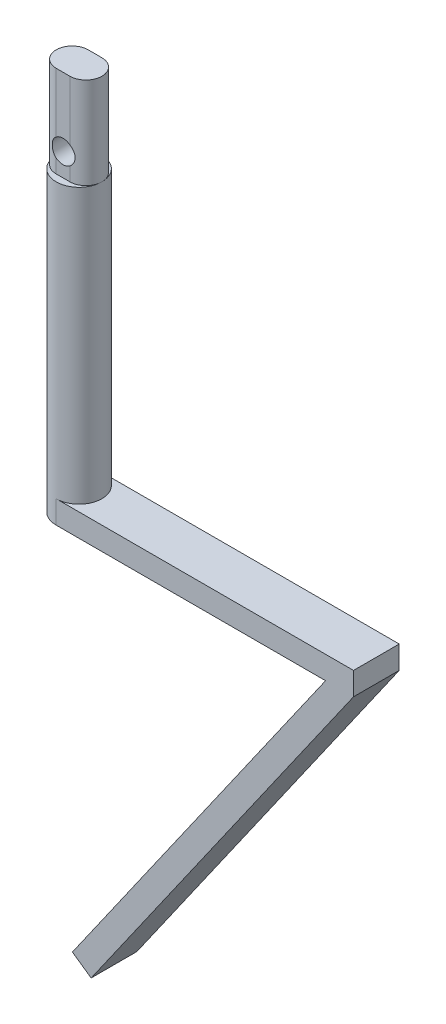
ISO-10303-21;
HEADER;
FILE_DESCRIPTION(('STEP AP214'),'2;1');
FILE_NAME('part.step','',(''),(''),'','','');
FILE_SCHEMA(('AUTOMOTIVE_DESIGN { 1 0 10303 214 1 1 1 1 }'));
ENDSEC;
DATA;
#1=APPLICATION_CONTEXT('core data for automotive mechanical design processes');
#2=APPLICATION_PROTOCOL_DEFINITION('international standard','automotive_design',2000,#1);
#3=PRODUCT_CONTEXT('',#1,'mechanical');
#4=PRODUCT('Part','Part','',(#3));
#5=PRODUCT_RELATED_PRODUCT_CATEGORY('part','',(#4));
#6=PRODUCT_DEFINITION_FORMATION('','',#4);
#7=PRODUCT_DEFINITION_CONTEXT('part definition',#1,'design');
#8=PRODUCT_DEFINITION('design','',#6,#7);
#9=PRODUCT_DEFINITION_SHAPE('','',#8);
#10=(LENGTH_UNIT() NAMED_UNIT(*) SI_UNIT(.MILLI.,.METRE.));
#11=(NAMED_UNIT(*) PLANE_ANGLE_UNIT() SI_UNIT($,.RADIAN.));
#12=(NAMED_UNIT(*) SI_UNIT($,.STERADIAN.) SOLID_ANGLE_UNIT());
#13=UNCERTAINTY_MEASURE_WITH_UNIT(LENGTH_MEASURE(1.E-05),#10,'distance_accuracy_value','');
#14=(GEOMETRIC_REPRESENTATION_CONTEXT(3) GLOBAL_UNCERTAINTY_ASSIGNED_CONTEXT((#13)) GLOBAL_UNIT_ASSIGNED_CONTEXT((#10,
#11,#12)) REPRESENTATION_CONTEXT('',''));
#15=CARTESIAN_POINT('',(0.,0.,0.));
#16=DIRECTION('',(0.,0.,1.));
#17=DIRECTION('',(1.,0.,0.));
#18=AXIS2_PLACEMENT_3D('',#15,#16,#17);
#19=CARTESIAN_POINT('',(0.,-5.,0.));
#20=DIRECTION('',(0.,-1.,0.));
#21=DIRECTION('',(0.,0.,-1.));
#22=AXIS2_PLACEMENT_3D('',#19,#20,#21);
#23=PLANE('',#22);
#24=DIRECTION('',(1.,0.,0.));
#25=VECTOR('',#24,1.);
#26=CARTESIAN_POINT('',(0.,-5.,-5.));
#27=LINE('',#26,#25);
#28=CARTESIAN_POINT('',(0.,-5.,-5.));
#29=VERTEX_POINT('',#28);
#30=CARTESIAN_POINT('',(58.8961270561927,-5.,-5.));
#31=VERTEX_POINT('',#30);
#32=EDGE_CURVE('E198',#29,#31,#27,.T.);
#33=ORIENTED_EDGE('',*,*,#32,.T.);
#34=DIRECTION('',(0.,0.,1.));
#35=VECTOR('',#34,1.);
#36=CARTESIAN_POINT('',(58.8961270561927,-5.,-107.404206760194));
#37=LINE('',#36,#35);
#38=CARTESIAN_POINT('',(58.8961270561927,-5.,5.));
#39=VERTEX_POINT('',#38);
#40=EDGE_CURVE('E163',#31,#39,#37,.T.);
#41=ORIENTED_EDGE('',*,*,#40,.T.);
#42=DIRECTION('',(-1.,0.,0.));
#43=VECTOR('',#42,1.);
#44=CARTESIAN_POINT('',(0.,-5.,5.));
#45=LINE('',#44,#43);
#46=CARTESIAN_POINT('',(0.,-5.,5.));
#47=VERTEX_POINT('',#46);
#48=EDGE_CURVE('E177',#39,#47,#45,.T.);
#49=ORIENTED_EDGE('',*,*,#48,.T.);
#50=CARTESIAN_POINT('',(0.,-5.,0.));
#51=DIRECTION('',(0.,-1.,0.));
#52=DIRECTION('',(0.,0.,-1.));
#53=AXIS2_PLACEMENT_3D('',#50,#51,#52);
#54=CIRCLE('',#53,5.);
#55=EDGE_CURVE('E194',#47,#29,#54,.T.);
#56=ORIENTED_EDGE('',*,*,#55,.T.);
#57=EDGE_LOOP('',(#33,#41,#49,#56));
#58=FACE_BOUND('',#57,.T.);
#59=ADVANCED_FACE('F39',(#58),#23,.T.);
#60=CARTESIAN_POINT('',(1.5,80.,-3.5));
#61=DIRECTION('',(0.,0.,1.));
#62=DIRECTION('',(1.,0.,0.));
#63=AXIS2_PLACEMENT_3D('',#60,#61,#62);
#64=PLANE('',#63);
#65=DIRECTION('',(0.,-1.,0.));
#66=VECTOR('',#65,1.);
#67=CARTESIAN_POINT('',(1.5,80.,-3.5));
#68=LINE('',#67,#66);
#69=CARTESIAN_POINT('',(1.5,80.,-3.5));
#70=VERTEX_POINT('',#69);
#71=CARTESIAN_POINT('',(1.5,67.,-3.5));
#72=VERTEX_POINT('',#71);
#73=EDGE_CURVE('E333',#70,#72,#68,.T.);
#74=ORIENTED_EDGE('',*,*,#73,.T.);
#75=CARTESIAN_POINT('',(0.,65.,-3.5));
#76=DIRECTION('',(0.,0.,1.));
#77=DIRECTION('',(1.,0.,0.));
#78=AXIS2_PLACEMENT_3D('',#75,#76,#77);
#79=CIRCLE('',#78,2.5);
#80=CARTESIAN_POINT('',(-1.5,67.,-3.5));
#81=VERTEX_POINT('',#80);
#82=EDGE_CURVE('E275',#72,#81,#79,.T.);
#83=ORIENTED_EDGE('',*,*,#82,.T.);
#84=DIRECTION('',(0.,-1.,0.));
#85=VECTOR('',#84,1.);
#86=CARTESIAN_POINT('',(-1.5,80.,-3.5));
#87=LINE('',#86,#85);
#88=CARTESIAN_POINT('',(-1.5,80.,-3.5));
#89=VERTEX_POINT('',#88);
#90=EDGE_CURVE('E346',#89,#81,#87,.T.);
#91=ORIENTED_EDGE('',*,*,#90,.F.);
#92=DIRECTION('',(-1.,0.,0.));
#93=VECTOR('',#92,1.);
#94=CARTESIAN_POINT('',(1.5,80.,-3.5));
#95=LINE('',#94,#93);
#96=EDGE_CURVE('E384',#70,#89,#95,.T.);
#97=ORIENTED_EDGE('',*,*,#96,.F.);
#98=EDGE_LOOP('',(#74,#83,#91,#97));
#99=FACE_BOUND('',#98,.T.);
#100=ADVANCED_FACE('F300',(#99),#64,.F.);
#101=CARTESIAN_POINT('',(1.5,80.,3.5));
#102=DIRECTION('',(0.,0.,-1.));
#103=DIRECTION('',(-1.,0.,0.));
#104=AXIS2_PLACEMENT_3D('',#101,#102,#103);
#105=PLANE('',#104);
#106=DIRECTION('',(0.,-1.,0.));
#107=VECTOR('',#106,1.);
#108=CARTESIAN_POINT('',(-1.5,80.,3.5));
#109=LINE('',#108,#107);
#110=CARTESIAN_POINT('',(-1.5,80.,3.5));
#111=VERTEX_POINT('',#110);
#112=CARTESIAN_POINT('',(-1.5,67.,3.5));
#113=VERTEX_POINT('',#112);
#114=EDGE_CURVE('E351',#111,#113,#109,.T.);
#115=ORIENTED_EDGE('',*,*,#114,.T.);
#116=CARTESIAN_POINT('',(0.,65.,3.5));
#117=DIRECTION('',(0.,0.,1.));
#118=DIRECTION('',(1.,0.,0.));
#119=AXIS2_PLACEMENT_3D('',#116,#117,#118);
#120=CIRCLE('',#119,2.5);
#121=CARTESIAN_POINT('',(1.5,67.,3.5));
#122=VERTEX_POINT('',#121);
#123=EDGE_CURVE('E229',#122,#113,#120,.T.);
#124=ORIENTED_EDGE('',*,*,#123,.F.);
#125=DIRECTION('',(0.,-1.,0.));
#126=VECTOR('',#125,1.);
#127=CARTESIAN_POINT('',(1.5,80.,3.5));
#128=LINE('',#127,#126);
#129=CARTESIAN_POINT('',(1.5,80.,3.5));
#130=VERTEX_POINT('',#129);
#131=EDGE_CURVE('E356',#130,#122,#128,.T.);
#132=ORIENTED_EDGE('',*,*,#131,.F.);
#133=DIRECTION('',(1.,0.,0.));
#134=VECTOR('',#133,1.);
#135=CARTESIAN_POINT('',(1.5,80.,3.5));
#136=LINE('',#135,#134);
#137=EDGE_CURVE('E378',#111,#130,#136,.T.);
#138=ORIENTED_EDGE('',*,*,#137,.F.);
#139=EDGE_LOOP('',(#115,#124,#132,#138));
#140=FACE_BOUND('',#139,.T.);
#141=ADVANCED_FACE('F297',(#140),#105,.F.);
#142=CARTESIAN_POINT('',(0.,60.,0.));
#143=DIRECTION('',(0.,1.,0.));
#144=DIRECTION('',(0.,0.,1.));
#145=AXIS2_PLACEMENT_3D('',#142,#143,#144);
#146=PLANE('',#145);
#147=DIRECTION('',(1.,0.,0.));
#148=VECTOR('',#147,1.);
#149=CARTESIAN_POINT('',(1.5,60.,3.5));
#150=LINE('',#149,#148);
#151=CARTESIAN_POINT('',(-1.5,60.,3.5));
#152=VERTEX_POINT('',#151);
#153=CARTESIAN_POINT('',(1.5,60.,3.5));
#154=VERTEX_POINT('',#153);
#155=EDGE_CURVE('E361',#152,#154,#150,.T.);
#156=ORIENTED_EDGE('',*,*,#155,.F.);
#157=CARTESIAN_POINT('',(-1.5,60.,0.));
#158=DIRECTION('',(0.,1.,0.));
#159=DIRECTION('',(0.,0.,1.));
#160=AXIS2_PLACEMENT_3D('',#157,#158,#159);
#161=CIRCLE('',#160,3.5);
#162=CARTESIAN_POINT('',(-5.,60.,0.));
#163=VERTEX_POINT('',#162);
#164=EDGE_CURVE('E48',#163,#152,#161,.T.);
#165=ORIENTED_EDGE('',*,*,#164,.F.);
#166=CARTESIAN_POINT('',(0.,60.,0.));
#167=DIRECTION('',(0.,1.,0.));
#168=DIRECTION('',(0.,0.,1.));
#169=AXIS2_PLACEMENT_3D('',#166,#167,#168);
#170=CIRCLE('',#169,5.);
#171=CARTESIAN_POINT('',(5.,60.,0.));
#172=VERTEX_POINT('',#171);
#173=EDGE_CURVE('E332',#163,#172,#170,.T.);
#174=ORIENTED_EDGE('',*,*,#173,.T.);
#175=CARTESIAN_POINT('',(1.5,60.,0.));
#176=DIRECTION('',(0.,1.,0.));
#177=DIRECTION('',(0.,0.,1.));
#178=AXIS2_PLACEMENT_3D('',#175,#176,#177);
#179=CIRCLE('',#178,3.5);
#180=EDGE_CURVE('E374',#154,#172,#179,.T.);
#181=ORIENTED_EDGE('',*,*,#180,.F.);
#182=EDGE_LOOP('',(#156,#165,#174,#181));
#183=FACE_BOUND('',#182,.T.);
#184=ADVANCED_FACE('F291',(#183),#146,.T.);
#185=CARTESIAN_POINT('',(0.,60.,0.));
#186=DIRECTION('',(0.,-1.,0.));
#187=DIRECTION('',(0.,0.,-1.));
#188=AXIS2_PLACEMENT_3D('',#185,#186,#187);
#189=CYLINDRICAL_SURFACE('',#188,5.);
#190=EDGE_CURVE('E337',#172,#163,#170,.T.);
#191=ORIENTED_EDGE('',*,*,#190,.F.);
#192=ORIENTED_EDGE('',*,*,#173,.F.);
#193=EDGE_LOOP('',(#191,#192));
#194=FACE_BOUND('',#193,.T.);
#195=CARTESIAN_POINT('',(0.,0.,0.));
#196=DIRECTION('',(0.,1.,0.));
#197=DIRECTION('',(0.,0.,1.));
#198=AXIS2_PLACEMENT_3D('',#195,#196,#197);
#199=CIRCLE('',#198,5.);
#200=CARTESIAN_POINT('',(0.,0.,5.));
#201=VERTEX_POINT('',#200);
#202=CARTESIAN_POINT('',(0.,0.,-5.));
#203=VERTEX_POINT('',#202);
#204=EDGE_CURVE('E329',#201,#203,#199,.T.);
#205=ORIENTED_EDGE('',*,*,#204,.T.);
#206=DIRECTION('',(0.,1.,0.));
#207=VECTOR('',#206,1.);
#208=CARTESIAN_POINT('',(0.,-5.,-5.));
#209=LINE('',#208,#207);
#210=EDGE_CURVE('E225',#29,#203,#209,.T.);
#211=ORIENTED_EDGE('',*,*,#210,.F.);
#212=ORIENTED_EDGE('',*,*,#55,.F.);
#213=DIRECTION('',(0.,1.,0.));
#214=VECTOR('',#213,1.);
#215=CARTESIAN_POINT('',(0.,-5.,5.));
#216=LINE('',#215,#214);
#217=EDGE_CURVE('E63',#47,#201,#216,.T.);
#218=ORIENTED_EDGE('',*,*,#217,.T.);
#219=EDGE_LOOP('',(#205,#211,#212,#218));
#220=FACE_BOUND('',#219,.T.);
#221=ADVANCED_FACE('F41',(#194,#220),#189,.T.);
#222=CARTESIAN_POINT('',(1.5,60.,-3.5));
#223=VERTEX_POINT('',#222);
#224=EDGE_CURVE('E344',#172,#223,#179,.T.);
#225=ORIENTED_EDGE('',*,*,#224,.F.);
#226=ORIENTED_EDGE('',*,*,#190,.T.);
#227=CARTESIAN_POINT('',(-1.5,60.,-3.5));
#228=VERTEX_POINT('',#227);
#229=EDGE_CURVE('E366',#228,#163,#161,.T.);
#230=ORIENTED_EDGE('',*,*,#229,.F.);
#231=DIRECTION('',(-1.,0.,0.));
#232=VECTOR('',#231,1.);
#233=CARTESIAN_POINT('',(1.5,60.,-3.5));
#234=LINE('',#233,#232);
#235=EDGE_CURVE('E370',#223,#228,#234,.T.);
#236=ORIENTED_EDGE('',*,*,#235,.F.);
#237=EDGE_LOOP('',(#225,#226,#230,#236));
#238=FACE_BOUND('',#237,.T.);
#239=ADVANCED_FACE('F286',(#238),#146,.T.);
#240=CARTESIAN_POINT('',(1.5,80.,0.));
#241=DIRECTION('',(0.,-1.,0.));
#242=DIRECTION('',(0.,0.,-1.));
#243=AXIS2_PLACEMENT_3D('',#240,#241,#242);
#244=CYLINDRICAL_SURFACE('',#243,3.5);
#245=ORIENTED_EDGE('',*,*,#131,.T.);
#246=CARTESIAN_POINT('',(1.5,67.,3.5));
#247=CARTESIAN_POINT('',(1.55550799347548,66.958371955028,3.50000182403295));
#248=CARTESIAN_POINT('',(1.60923870833891,66.9144588293274,3.49867944525515));
#249=CARTESIAN_POINT('',(1.71279062055592,66.8224009672337,3.49390928275372));
#250=CARTESIAN_POINT('',(1.76261405184149,66.7742586826803,3.49046272363378));
#251=CARTESIAN_POINT('',(1.90556669638334,66.6241481101724,3.47773704351073));
#252=CARTESIAN_POINT('',(1.99243454591589,66.5163031878993,3.46606714779262));
#253=CARTESIAN_POINT('',(2.14697715547835,66.2882058085238,3.44057754469779));
#254=CARTESIAN_POINT('',(2.21467805357324,66.1679705565645,3.42676080522302));
#255=CARTESIAN_POINT('',(2.32948955422713,65.9178244356335,3.40079705982798));
#256=CARTESIAN_POINT('',(2.37659841645206,65.7879127499444,3.38865019509646));
#257=CARTESIAN_POINT('',(2.44966264627943,65.518691121801,3.36892129127617));
#258=CARTESIAN_POINT('',(2.47511093269614,65.3792343888022,3.36144970887882));
#259=CARTESIAN_POINT('',(2.50207601382924,65.097850622895,3.35351356506441));
#260=CARTESIAN_POINT('',(2.50360081172963,64.9559244320074,3.35304666035743));
#261=CARTESIAN_POINT('',(2.48310534227236,64.6796685934241,3.35910651510825));
#262=CARTESIAN_POINT('',(2.46202161731984,64.5452617154958,3.36535511270281));
#263=CARTESIAN_POINT('',(2.3984746322049,64.2818886700046,3.38287085396033));
#264=CARTESIAN_POINT('',(2.35599929615826,64.1529256201812,3.39414083185271));
#265=CARTESIAN_POINT('',(2.25009827301545,63.9018571957295,3.4191146982783));
#266=CARTESIAN_POINT('',(2.18636318784526,63.7798862737116,3.43285305993864));
#267=CARTESIAN_POINT('',(2.03973449354262,63.5480174571998,3.45893078315557));
#268=CARTESIAN_POINT('',(1.95686451906037,63.4381049137223,3.47127184280615));
#269=CARTESIAN_POINT('',(1.81037063918458,63.2739015145224,3.48665088787467));
#270=CARTESIAN_POINT('',(1.75217828172462,63.2148596610603,3.4914370119411));
#271=CARTESIAN_POINT('',(1.63017169840648,63.1027893773518,3.49811293680924));
#272=CARTESIAN_POINT('',(1.56636009880837,63.0497581641458,3.50000408311604));
#273=CARTESIAN_POINT('',(1.5,63.,3.5));
#274=B_SPLINE_CURVE_WITH_KNOTS('',3,(#246,#247,#248,#249,#250,#251,#252,#253,#254,#255,#256,
#257,#258,#259,#260,#261,#262,#263,#264,#265,#266,#267,#268,#269,#270,#271,#272,#273),
.UNSPECIFIED.,.F.,.F.,(4,2,2,2,2,2,2,2,2,2,2,2,2,4),(0.,0.207986641866071,0.415853490103775,
0.83063780263915,1.24485371679656,1.65910463160947,2.08280566602559,2.50636495565972,
2.91303287689119,3.31993062600181,3.73302908161793,4.14561999843526,4.39431324513266,
4.64289087099999),.UNSPECIFIED.);
#275=CARTESIAN_POINT('',(1.5,63.,3.5));
#276=VERTEX_POINT('',#275);
#277=EDGE_CURVE('E274',#122,#276,#274,.T.);
#278=ORIENTED_EDGE('',*,*,#277,.T.);
#279=EDGE_CURVE('E360',#276,#154,#128,.T.);
#280=ORIENTED_EDGE('',*,*,#279,.T.);
#281=ORIENTED_EDGE('',*,*,#180,.T.);
#282=ORIENTED_EDGE('',*,*,#224,.T.);
#283=CARTESIAN_POINT('',(1.5,63.,-3.5));
#284=VERTEX_POINT('',#283);
#285=EDGE_CURVE('E340',#284,#223,#68,.T.);
#286=ORIENTED_EDGE('',*,*,#285,.F.);
#287=CARTESIAN_POINT('',(1.5,63.,-3.5));
#288=CARTESIAN_POINT('',(1.55550799347547,63.041628044972,-3.50000182403295));
#289=CARTESIAN_POINT('',(1.60923870833891,63.0855411706726,-3.49867944525516));
#290=CARTESIAN_POINT('',(1.71279062055592,63.1775990327663,-3.49390928275372));
#291=CARTESIAN_POINT('',(1.76261405184149,63.2257413173198,-3.49046272363378));
#292=CARTESIAN_POINT('',(1.90556669638334,63.3758518898276,-3.47773704351073));
#293=CARTESIAN_POINT('',(1.99243454591589,63.4836968121007,-3.46606714779262));
#294=CARTESIAN_POINT('',(2.14697715547835,63.7117941914762,-3.44057754469779));
#295=CARTESIAN_POINT('',(2.21467805357324,63.8320294434355,-3.42676080522303));
#296=CARTESIAN_POINT('',(2.32948955422713,64.0821755643665,-3.40079705982798));
#297=CARTESIAN_POINT('',(2.37659841645206,64.2120872500556,-3.38865019509646));
#298=CARTESIAN_POINT('',(2.44966264627943,64.481308878199,-3.36892129127617));
#299=CARTESIAN_POINT('',(2.47511093269614,64.6207656111978,-3.36144970887882));
#300=CARTESIAN_POINT('',(2.50207601382924,64.902149377105,-3.35351356506441));
#301=CARTESIAN_POINT('',(2.50360081172963,65.0440755679926,-3.35304666035744));
#302=CARTESIAN_POINT('',(2.48310534227236,65.3203314065759,-3.35910651510825));
#303=CARTESIAN_POINT('',(2.46202161731984,65.4547382845042,-3.36535511270281));
#304=CARTESIAN_POINT('',(2.3984746322049,65.7181113299954,-3.38287085396033));
#305=CARTESIAN_POINT('',(2.35599929615826,65.8470743798188,-3.39414083185271));
#306=CARTESIAN_POINT('',(2.25009827301545,66.0981428042704,-3.4191146982783));
#307=CARTESIAN_POINT('',(2.18636318784527,66.2201137262884,-3.43285305993864));
#308=CARTESIAN_POINT('',(2.03973449354262,66.4519825428002,-3.45893078315557));
#309=CARTESIAN_POINT('',(1.95686451906037,66.5618950862777,-3.47127184280615));
#310=CARTESIAN_POINT('',(1.81037063918457,66.7260984854776,-3.48665088787468));
#311=CARTESIAN_POINT('',(1.75217828172461,66.7851403389397,-3.4914370119411));
#312=CARTESIAN_POINT('',(1.63017169840648,66.8972106226482,-3.49811293680924));
#313=CARTESIAN_POINT('',(1.56636009880837,66.9502418358542,-3.50000408311605));
#314=CARTESIAN_POINT('',(1.5,67.,-3.5));
#315=B_SPLINE_CURVE_WITH_KNOTS('',3,(#287,#288,#289,#290,#291,#292,#293,#294,#295,#296,#297,
#298,#299,#300,#301,#302,#303,#304,#305,#306,#307,#308,#309,#310,#311,#312,#313,#314),
.UNSPECIFIED.,.F.,.F.,(4,2,2,2,2,2,2,2,2,2,2,2,2,4),(0.,0.207986641866073,0.415853490103778,
0.83063780263915,1.24485371679656,1.65910463160947,2.08280566602559,2.50636495565973,
2.91303287689119,3.31993062600181,3.73302908161791,4.14561999843527,4.39431324513266,
4.64289087099999),.UNSPECIFIED.);
#316=EDGE_CURVE('E266',#284,#72,#315,.T.);
#317=ORIENTED_EDGE('',*,*,#316,.T.);
#318=ORIENTED_EDGE('',*,*,#73,.F.);
#319=CARTESIAN_POINT('',(1.5,80.,0.));
#320=DIRECTION('',(0.,1.,0.));
#321=DIRECTION('',(0.,0.,1.));
#322=AXIS2_PLACEMENT_3D('',#319,#320,#321);
#323=CIRCLE('',#322,3.5);
#324=EDGE_CURVE('E365',#130,#70,#323,.T.);
#325=ORIENTED_EDGE('',*,*,#324,.F.);
#326=EDGE_LOOP('',(#245,#278,#280,#281,#282,#286,#317,#318,#325));
#327=FACE_BOUND('',#326,.T.);
#328=ADVANCED_FACE('F282',(#327),#244,.T.);
#329=CARTESIAN_POINT('',(-1.5,63.,-3.5));
#330=VERTEX_POINT('',#329);
#331=EDGE_CURVE('E350',#330,#228,#87,.T.);
#332=ORIENTED_EDGE('',*,*,#331,.F.);
#333=EDGE_CURVE('E276',#330,#284,#79,.T.);
#334=ORIENTED_EDGE('',*,*,#333,.T.);
#335=ORIENTED_EDGE('',*,*,#285,.T.);
#336=ORIENTED_EDGE('',*,*,#235,.T.);
#337=EDGE_LOOP('',(#332,#334,#335,#336));
#338=FACE_BOUND('',#337,.T.);
#339=ADVANCED_FACE('F285',(#338),#64,.F.);
#340=CARTESIAN_POINT('',(-1.5,80.,0.));
#341=DIRECTION('',(0.,-1.,0.));
#342=DIRECTION('',(0.,0.,-1.));
#343=AXIS2_PLACEMENT_3D('',#340,#341,#342);
#344=CYLINDRICAL_SURFACE('',#343,3.5);
#345=ORIENTED_EDGE('',*,*,#90,.T.);
#346=CARTESIAN_POINT('',(-1.5,67.,-3.5));
#347=CARTESIAN_POINT('',(-1.55550799347548,66.958371955028,-3.50000182403295));
#348=CARTESIAN_POINT('',(-1.60923870833891,66.9144588293274,-3.49867944525515));
#349=CARTESIAN_POINT('',(-1.71279062055592,66.8224009672337,-3.49390928275372));
#350=CARTESIAN_POINT('',(-1.76261405184149,66.7742586826803,-3.49046272363378));
#351=CARTESIAN_POINT('',(-1.90556669638334,66.6241481101724,-3.47773704351072));
#352=CARTESIAN_POINT('',(-1.99243454591589,66.5163031878993,-3.46606714779262));
#353=CARTESIAN_POINT('',(-2.14697715547835,66.2882058085238,-3.44057754469778));
#354=CARTESIAN_POINT('',(-2.21467805357325,66.1679705565645,-3.42676080522302));
#355=CARTESIAN_POINT('',(-2.32948955422714,65.9178244356335,-3.40079705982798));
#356=CARTESIAN_POINT('',(-2.37659841645206,65.7879127499444,-3.38865019509646));
#357=CARTESIAN_POINT('',(-2.44966264627943,65.518691121801,-3.36892129127617));
#358=CARTESIAN_POINT('',(-2.47511093269614,65.3792343888022,-3.36144970887882));
#359=CARTESIAN_POINT('',(-2.50207601382924,65.097850622895,-3.35351356506441));
#360=CARTESIAN_POINT('',(-2.50360081172963,64.9559244320074,-3.35304666035743));
#361=CARTESIAN_POINT('',(-2.48310534227236,64.6796685934241,-3.35910651510825));
#362=CARTESIAN_POINT('',(-2.46202161731984,64.5452617154958,-3.36535511270281));
#363=CARTESIAN_POINT('',(-2.3984746322049,64.2818886700046,-3.38287085396033));
#364=CARTESIAN_POINT('',(-2.35599929615826,64.1529256201812,-3.39414083185271));
#365=CARTESIAN_POINT('',(-2.25009827301545,63.9018571957295,-3.4191146982783));
#366=CARTESIAN_POINT('',(-2.18636318784526,63.7798862737116,-3.43285305993864));
#367=CARTESIAN_POINT('',(-2.03973449354262,63.5480174571998,-3.45893078315557));
#368=CARTESIAN_POINT('',(-1.95686451906037,63.4381049137223,-3.47127184280615));
#369=CARTESIAN_POINT('',(-1.81037063918458,63.2739015145224,-3.48665088787467));
#370=CARTESIAN_POINT('',(-1.75217828172462,63.2148596610603,-3.4914370119411));
#371=CARTESIAN_POINT('',(-1.63017169840648,63.1027893773518,-3.49811293680924));
#372=CARTESIAN_POINT('',(-1.56636009880837,63.0497581641458,-3.50000408311604));
#373=CARTESIAN_POINT('',(-1.5,63.,-3.5));
#374=B_SPLINE_CURVE_WITH_KNOTS('',3,(#346,#347,#348,#349,#350,#351,#352,#353,#354,#355,#356,
#357,#358,#359,#360,#361,#362,#363,#364,#365,#366,#367,#368,#369,#370,#371,#372,#373),
.UNSPECIFIED.,.F.,.F.,(4,2,2,2,2,2,2,2,2,2,2,2,2,4),(0.,0.207986641866073,0.415853490103778,
0.83063780263915,1.2448537167966,1.65910463160945,2.08280566602561,2.50636495565973,
2.91303287689119,3.31993062600181,3.73302908161793,4.14561999843526,4.39431324513266,
4.64289087099999),.UNSPECIFIED.);
#375=EDGE_CURVE('E242',#81,#330,#374,.T.);
#376=ORIENTED_EDGE('',*,*,#375,.T.);
#377=ORIENTED_EDGE('',*,*,#331,.T.);
#378=ORIENTED_EDGE('',*,*,#229,.T.);
#379=ORIENTED_EDGE('',*,*,#164,.T.);
#380=CARTESIAN_POINT('',(-1.5,63.,3.5));
#381=VERTEX_POINT('',#380);
#382=EDGE_CURVE('E355',#381,#152,#109,.T.);
#383=ORIENTED_EDGE('',*,*,#382,.F.);
#384=CARTESIAN_POINT('',(-1.5,63.,3.5));
#385=CARTESIAN_POINT('',(-1.55550799347547,63.041628044972,3.50000182403295));
#386=CARTESIAN_POINT('',(-1.60923870833891,63.0855411706726,3.49867944525516));
#387=CARTESIAN_POINT('',(-1.71279062055592,63.1775990327663,3.49390928275372));
#388=CARTESIAN_POINT('',(-1.76261405184149,63.2257413173198,3.49046272363378));
#389=CARTESIAN_POINT('',(-1.90556669638334,63.3758518898276,3.47773704351073));
#390=CARTESIAN_POINT('',(-1.99243454591589,63.4836968121007,3.46606714779262));
#391=CARTESIAN_POINT('',(-2.14697715547834,63.7117941914762,3.44057754469779));
#392=CARTESIAN_POINT('',(-2.21467805357324,63.8320294434355,3.42676080522303));
#393=CARTESIAN_POINT('',(-2.32948955422713,64.0821755643665,3.40079705982798));
#394=CARTESIAN_POINT('',(-2.37659841645206,64.2120872500556,3.38865019509646));
#395=CARTESIAN_POINT('',(-2.44966264627943,64.481308878199,3.36892129127617));
#396=CARTESIAN_POINT('',(-2.47511093269613,64.6207656111978,3.36144970887882));
#397=CARTESIAN_POINT('',(-2.50207601382924,64.902149377105,3.35351356506441));
#398=CARTESIAN_POINT('',(-2.50360081172963,65.0440755679926,3.35304666035744));
#399=CARTESIAN_POINT('',(-2.48310534227236,65.3203314065759,3.35910651510825));
#400=CARTESIAN_POINT('',(-2.46202161731984,65.4547382845042,3.36535511270281));
#401=CARTESIAN_POINT('',(-2.3984746322049,65.7181113299954,3.38287085396033));
#402=CARTESIAN_POINT('',(-2.35599929615826,65.8470743798188,3.39414083185271));
#403=CARTESIAN_POINT('',(-2.25009827301545,66.0981428042705,3.4191146982783));
#404=CARTESIAN_POINT('',(-2.18636318784526,66.2201137262884,3.43285305993864));
#405=CARTESIAN_POINT('',(-2.03973449354262,66.4519825428002,3.45893078315557));
#406=CARTESIAN_POINT('',(-1.95686451906037,66.5618950862777,3.47127184280615));
#407=CARTESIAN_POINT('',(-1.81037063918458,66.7260984854776,3.48665088787467));
#408=CARTESIAN_POINT('',(-1.75217828172462,66.7851403389397,3.4914370119411));
#409=CARTESIAN_POINT('',(-1.63017169840648,66.8972106226482,3.49811293680924));
#410=CARTESIAN_POINT('',(-1.56636009880837,66.9502418358542,3.50000408311605));
#411=CARTESIAN_POINT('',(-1.5,67.,3.5));
#412=B_SPLINE_CURVE_WITH_KNOTS('',3,(#384,#385,#386,#387,#388,#389,#390,#391,#392,#393,#394,
#395,#396,#397,#398,#399,#400,#401,#402,#403,#404,#405,#406,#407,#408,#409,#410,#411),
.UNSPECIFIED.,.F.,.F.,(4,2,2,2,2,2,2,2,2,2,2,2,2,4),(0.,0.207986641866074,0.415853490103778,
0.83063780263915,1.24485371679657,1.65910463160945,2.08280566602555,2.50636495565973,
2.91303287689119,3.31993062600181,3.73302908161793,4.14561999843526,4.39431324513266,
4.64289087099999),.UNSPECIFIED.);
#413=EDGE_CURVE('E232',#381,#113,#412,.T.);
#414=ORIENTED_EDGE('',*,*,#413,.T.);
#415=ORIENTED_EDGE('',*,*,#114,.F.);
#416=CARTESIAN_POINT('',(-1.5,80.,0.));
#417=DIRECTION('',(0.,1.,0.));
#418=DIRECTION('',(0.,0.,1.));
#419=AXIS2_PLACEMENT_3D('',#416,#417,#418);
#420=CIRCLE('',#419,3.5);
#421=EDGE_CURVE('E381',#89,#111,#420,.T.);
#422=ORIENTED_EDGE('',*,*,#421,.F.);
#423=EDGE_LOOP('',(#345,#376,#377,#378,#379,#383,#414,#415,#422));
#424=FACE_BOUND('',#423,.T.);
#425=ADVANCED_FACE('F248',(#424),#344,.T.);
#426=ORIENTED_EDGE('',*,*,#279,.F.);
#427=CARTESIAN_POINT('',(0.,65.,3.5));
#428=DIRECTION('',(0.,0.,-1.));
#429=DIRECTION('',(-1.,0.,0.));
#430=AXIS2_PLACEMENT_3D('',#427,#428,#429);
#431=CIRCLE('',#430,2.5);
#432=EDGE_CURVE('E11',#276,#381,#431,.T.);
#433=ORIENTED_EDGE('',*,*,#432,.T.);
#434=ORIENTED_EDGE('',*,*,#382,.T.);
#435=ORIENTED_EDGE('',*,*,#155,.T.);
#436=EDGE_LOOP('',(#426,#433,#434,#435));
#437=FACE_BOUND('',#436,.T.);
#438=ADVANCED_FACE('F409',(#437),#105,.F.);
#439=CARTESIAN_POINT('',(1.5,80.,0.));
#440=DIRECTION('',(0.,1.,0.));
#441=DIRECTION('',(0.,0.,1.));
#442=AXIS2_PLACEMENT_3D('',#439,#440,#441);
#443=PLANE('',#442);
#444=ORIENTED_EDGE('',*,*,#324,.T.);
#445=ORIENTED_EDGE('',*,*,#96,.T.);
#446=ORIENTED_EDGE('',*,*,#421,.T.);
#447=ORIENTED_EDGE('',*,*,#137,.T.);
#448=EDGE_LOOP('',(#444,#445,#446,#447));
#449=FACE_BOUND('',#448,.T.);
#450=ADVANCED_FACE('F258',(#449),#443,.T.);
#451=CARTESIAN_POINT('',(0.,65.,-11.5));
#452=DIRECTION('',(0.,0.,1.));
#453=DIRECTION('',(1.,0.,0.));
#454=AXIS2_PLACEMENT_3D('',#451,#452,#453);
#455=CYLINDRICAL_SURFACE('',#454,2.5);
#456=ORIENTED_EDGE('',*,*,#333,.F.);
#457=ORIENTED_EDGE('',*,*,#375,.F.);
#458=ORIENTED_EDGE('',*,*,#82,.F.);
#459=ORIENTED_EDGE('',*,*,#316,.F.);
#460=EDGE_LOOP('',(#456,#457,#458,#459));
#461=FACE_BOUND('',#460,.T.);
#462=ORIENTED_EDGE('',*,*,#123,.T.);
#463=ORIENTED_EDGE('',*,*,#413,.F.);
#464=ORIENTED_EDGE('',*,*,#432,.F.);
#465=ORIENTED_EDGE('',*,*,#277,.F.);
#466=EDGE_LOOP('',(#462,#463,#464,#465));
#467=FACE_BOUND('',#466,.T.);
#468=ADVANCED_FACE('F252',(#461,#467),#455,.F.);
#469=CARTESIAN_POINT('',(0.,-5.,-5.));
#470=DIRECTION('',(0.,0.,1.));
#471=DIRECTION('',(1.,0.,0.));
#472=AXIS2_PLACEMENT_3D('',#469,#470,#471);
#473=PLANE('',#472);
#474=DIRECTION('',(1.,0.,0.));
#475=VECTOR('',#474,1.);
#476=CARTESIAN_POINT('',(0.,0.,-5.));
#477=LINE('',#476,#475);
#478=CARTESIAN_POINT('',(65.,0.,-5.));
#479=VERTEX_POINT('',#478);
#480=EDGE_CURVE('E193',#203,#479,#477,.T.);
#481=ORIENTED_EDGE('',*,*,#480,.T.);
#482=DIRECTION('',(0.,1.,0.));
#483=VECTOR('',#482,1.);
#484=CARTESIAN_POINT('',(65.,-5.,-5.));
#485=LINE('',#484,#483);
#486=CARTESIAN_POINT('',(65.,-5.,-5.));
#487=VERTEX_POINT('',#486);
#488=EDGE_CURVE('E221',#487,#479,#485,.T.);
#489=ORIENTED_EDGE('',*,*,#488,.F.);
#490=DIRECTION('',(-0.573576436351044,-0.819152044288993,0.));
#491=VECTOR('',#490,1.);
#492=CARTESIAN_POINT('',(65.,-5.,-5.));
#493=LINE('',#492,#491);
#494=CARTESIAN_POINT('',(7.64235636489562,-86.9152044288993,-5.));
#495=VERTEX_POINT('',#494);
#496=EDGE_CURVE('E181',#487,#495,#493,.T.);
#497=ORIENTED_EDGE('',*,*,#496,.T.);
#498=DIRECTION('',(-0.819152044288993,0.573576436351045,0.));
#499=VECTOR('',#498,1.);
#500=CARTESIAN_POINT('',(7.64235636489562,-86.9152044288993,-5.));
#501=LINE('',#500,#499);
#502=CARTESIAN_POINT('',(3.54659614345065,-84.0473222471441,-5.));
#503=VERTEX_POINT('',#502);
#504=EDGE_CURVE('E187',#495,#503,#501,.T.);
#505=ORIENTED_EDGE('',*,*,#504,.T.);
#506=DIRECTION('',(0.573576436351044,0.819152044288993,0.));
#507=VECTOR('',#506,1.);
#508=CARTESIAN_POINT('',(3.54659614345065,-84.0473222471441,-5.));
#509=LINE('',#508,#507);
#510=EDGE_CURVE('E158',#503,#31,#509,.T.);
#511=ORIENTED_EDGE('',*,*,#510,.T.);
#512=ORIENTED_EDGE('',*,*,#32,.F.);
#513=ORIENTED_EDGE('',*,*,#210,.T.);
#514=EDGE_LOOP('',(#481,#489,#497,#505,#511,#512,#513));
#515=FACE_BOUND('',#514,.T.);
#516=ADVANCED_FACE('F257',(#515),#473,.F.);
#517=CARTESIAN_POINT('',(65.,-5.,5.));
#518=DIRECTION('',(-1.,0.,0.));
#519=DIRECTION('',(0.,0.,1.));
#520=AXIS2_PLACEMENT_3D('',#517,#518,#519);
#521=PLANE('',#520);
#522=DIRECTION('',(0.,0.,1.));
#523=VECTOR('',#522,1.);
#524=CARTESIAN_POINT('',(65.,0.,5.));
#525=LINE('',#524,#523);
#526=CARTESIAN_POINT('',(65.,0.,5.));
#527=VERTEX_POINT('',#526);
#528=EDGE_CURVE('E210',#479,#527,#525,.T.);
#529=ORIENTED_EDGE('',*,*,#528,.T.);
#530=DIRECTION('',(0.,1.,0.));
#531=VECTOR('',#530,1.);
#532=CARTESIAN_POINT('',(65.,-5.,5.));
#533=LINE('',#532,#531);
#534=CARTESIAN_POINT('',(65.,-5.,5.));
#535=VERTEX_POINT('',#534);
#536=EDGE_CURVE('E217',#535,#527,#533,.T.);
#537=ORIENTED_EDGE('',*,*,#536,.F.);
#538=DIRECTION('',(0.,0.,1.));
#539=VECTOR('',#538,1.);
#540=CARTESIAN_POINT('',(65.,-5.,5.));
#541=LINE('',#540,#539);
#542=EDGE_CURVE('E203',#487,#535,#541,.T.);
#543=ORIENTED_EDGE('',*,*,#542,.F.);
#544=ORIENTED_EDGE('',*,*,#488,.T.);
#545=EDGE_LOOP('',(#529,#537,#543,#544));
#546=FACE_BOUND('',#545,.T.);
#547=ADVANCED_FACE('F316',(#546),#521,.F.);
#548=CARTESIAN_POINT('',(0.,-5.,5.));
#549=DIRECTION('',(0.,0.,-1.));
#550=DIRECTION('',(-1.,0.,0.));
#551=AXIS2_PLACEMENT_3D('',#548,#549,#550);
#552=PLANE('',#551);
#553=DIRECTION('',(-1.,0.,0.));
#554=VECTOR('',#553,1.);
#555=CARTESIAN_POINT('',(0.,0.,5.));
#556=LINE('',#555,#554);
#557=EDGE_CURVE('E199',#527,#201,#556,.T.);
#558=ORIENTED_EDGE('',*,*,#557,.T.);
#559=ORIENTED_EDGE('',*,*,#217,.F.);
#560=ORIENTED_EDGE('',*,*,#48,.F.);
#561=DIRECTION('',(-0.573576436351044,-0.819152044288993,0.));
#562=VECTOR('',#561,1.);
#563=CARTESIAN_POINT('',(3.54659614345065,-84.0473222471441,5.));
#564=LINE('',#563,#562);
#565=CARTESIAN_POINT('',(3.54659614345065,-84.0473222471441,5.));
#566=VERTEX_POINT('',#565);
#567=EDGE_CURVE('E55',#39,#566,#564,.T.);
#568=ORIENTED_EDGE('',*,*,#567,.T.);
#569=DIRECTION('',(0.819152044288993,-0.573576436351045,0.));
#570=VECTOR('',#569,1.);
#571=CARTESIAN_POINT('',(7.64235636489562,-86.9152044288993,5.));
#572=LINE('',#571,#570);
#573=CARTESIAN_POINT('',(7.64235636489562,-86.9152044288993,5.));
#574=VERTEX_POINT('',#573);
#575=EDGE_CURVE('E166',#566,#574,#572,.T.);
#576=ORIENTED_EDGE('',*,*,#575,.T.);
#577=DIRECTION('',(0.573576436351044,0.819152044288993,0.));
#578=VECTOR('',#577,1.);
#579=CARTESIAN_POINT('',(65.,-5.,5.));
#580=LINE('',#579,#578);
#581=EDGE_CURVE('E173',#574,#535,#580,.T.);
#582=ORIENTED_EDGE('',*,*,#581,.T.);
#583=ORIENTED_EDGE('',*,*,#536,.T.);
#584=EDGE_LOOP('',(#558,#559,#560,#568,#576,#582,#583));
#585=FACE_BOUND('',#584,.T.);
#586=ADVANCED_FACE('F176',(#585),#552,.F.);
#587=CARTESIAN_POINT('',(0.,0.,0.));
#588=DIRECTION('',(0.,-1.,0.));
#589=DIRECTION('',(0.,0.,-1.));
#590=AXIS2_PLACEMENT_3D('',#587,#588,#589);
#591=PLANE('',#590);
#592=ORIENTED_EDGE('',*,*,#204,.F.);
#593=ORIENTED_EDGE('',*,*,#557,.F.);
#594=ORIENTED_EDGE('',*,*,#528,.F.);
#595=ORIENTED_EDGE('',*,*,#480,.F.);
#596=EDGE_LOOP('',(#592,#593,#594,#595));
#597=FACE_BOUND('',#596,.T.);
#598=ADVANCED_FACE('F310',(#597),#591,.F.);
#599=CARTESIAN_POINT('',(65.,-5.,-107.404206760194));
#600=DIRECTION('',(0.819152044288993,-0.573576436351044,0.));
#601=DIRECTION('',(0.573576436351044,0.819152044288993,0.));
#602=AXIS2_PLACEMENT_3D('',#599,#600,#601);
#603=PLANE('',#602);
#604=ORIENTED_EDGE('',*,*,#496,.F.);
#605=ORIENTED_EDGE('',*,*,#542,.T.);
#606=ORIENTED_EDGE('',*,*,#581,.F.);
#607=DIRECTION('',(0.,0.,1.));
#608=VECTOR('',#607,1.);
#609=CARTESIAN_POINT('',(7.64235636489562,-86.9152044288993,-107.404206760194));
#610=LINE('',#609,#608);
#611=EDGE_CURVE('E162',#495,#574,#610,.T.);
#612=ORIENTED_EDGE('',*,*,#611,.F.);
#613=EDGE_LOOP('',(#604,#605,#606,#612));
#614=FACE_BOUND('',#613,.T.);
#615=ADVANCED_FACE('F313',(#614),#603,.T.);
#616=CARTESIAN_POINT('',(7.64235636489562,-86.9152044288993,-107.404206760194));
#617=DIRECTION('',(-0.573576436351045,-0.819152044288993,0.));
#618=DIRECTION('',(0.819152044288993,-0.573576436351045,0.));
#619=AXIS2_PLACEMENT_3D('',#616,#617,#618);
#620=PLANE('',#619);
#621=ORIENTED_EDGE('',*,*,#504,.F.);
#622=ORIENTED_EDGE('',*,*,#611,.T.);
#623=ORIENTED_EDGE('',*,*,#575,.F.);
#624=DIRECTION('',(0.,0.,1.));
#625=VECTOR('',#624,1.);
#626=CARTESIAN_POINT('',(3.54659614345065,-84.0473222471441,-107.404206760194));
#627=LINE('',#626,#625);
#628=EDGE_CURVE('E155',#503,#566,#627,.T.);
#629=ORIENTED_EDGE('',*,*,#628,.F.);
#630=EDGE_LOOP('',(#621,#622,#623,#629));
#631=FACE_BOUND('',#630,.T.);
#632=ADVANCED_FACE('F167',(#631),#620,.T.);
#633=CARTESIAN_POINT('',(3.54659614345065,-84.0473222471441,-107.404206760194));
#634=DIRECTION('',(-0.819152044288993,0.573576436351044,0.));
#635=DIRECTION('',(-0.573576436351044,-0.819152044288993,0.));
#636=AXIS2_PLACEMENT_3D('',#633,#634,#635);
#637=PLANE('',#636);
#638=ORIENTED_EDGE('',*,*,#510,.F.);
#639=ORIENTED_EDGE('',*,*,#628,.T.);
#640=ORIENTED_EDGE('',*,*,#567,.F.);
#641=ORIENTED_EDGE('',*,*,#40,.F.);
#642=EDGE_LOOP('',(#638,#639,#640,#641));
#643=FACE_BOUND('',#642,.T.);
#644=ADVANCED_FACE('F157',(#643),#637,.T.);
#645=CLOSED_SHELL('',(#59,#100,#141,#184,#221,#239,#328,#339,#425,#438,#450,#468,#516,#547,#586,
#598,#615,#632,#644));
#646=MANIFOLD_SOLID_BREP('B2',#645);
#647=ADVANCED_BREP_SHAPE_REPRESENTATION('',(#18,#646),#14);
#648=SHAPE_DEFINITION_REPRESENTATION(#9,#647);
ENDSEC;
END-ISO-10303-21;
